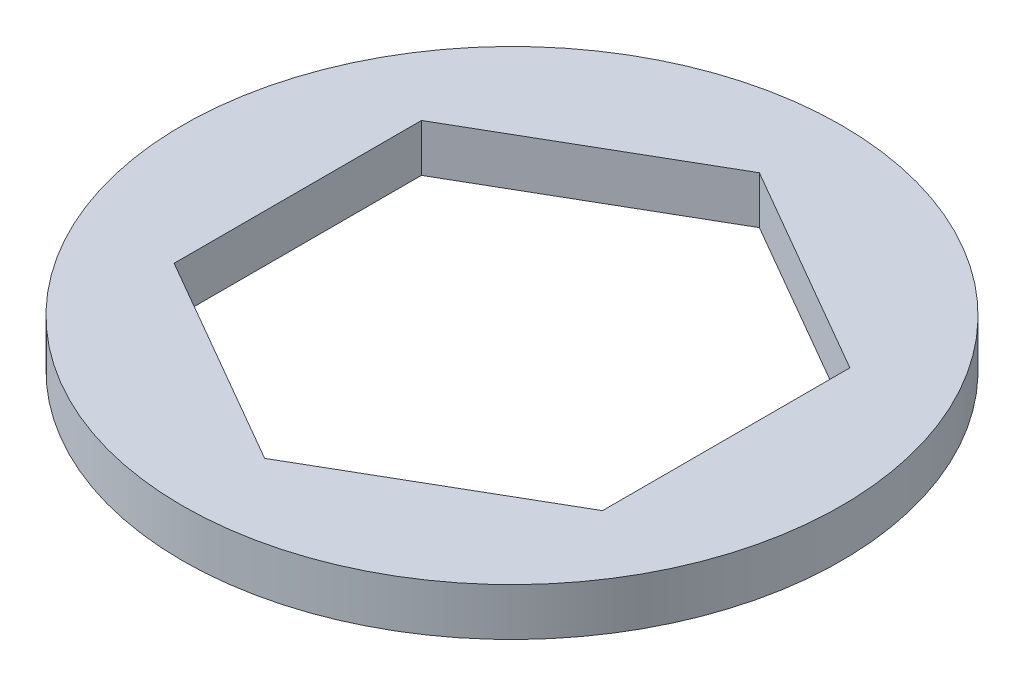
ISO-10303-21;
HEADER;
FILE_DESCRIPTION(('STEP AP214'),'2;1');
FILE_NAME('part.step','',(''),(''),'','','');
FILE_SCHEMA(('AUTOMOTIVE_DESIGN { 1 0 10303 214 1 1 1 1 }'));
ENDSEC;
DATA;
#1=APPLICATION_CONTEXT('core data for automotive mechanical design processes');
#2=APPLICATION_PROTOCOL_DEFINITION('international standard','automotive_design',2000,#1);
#3=PRODUCT_CONTEXT('',#1,'mechanical');
#4=PRODUCT('Part','Part','',(#3));
#5=PRODUCT_RELATED_PRODUCT_CATEGORY('part','',(#4));
#6=PRODUCT_DEFINITION_FORMATION('','',#4);
#7=PRODUCT_DEFINITION_CONTEXT('part definition',#1,'design');
#8=PRODUCT_DEFINITION('design','',#6,#7);
#9=PRODUCT_DEFINITION_SHAPE('','',#8);
#10=(LENGTH_UNIT() NAMED_UNIT(*) SI_UNIT(.MILLI.,.METRE.));
#11=(NAMED_UNIT(*) PLANE_ANGLE_UNIT() SI_UNIT($,.RADIAN.));
#12=(NAMED_UNIT(*) SI_UNIT($,.STERADIAN.) SOLID_ANGLE_UNIT());
#13=UNCERTAINTY_MEASURE_WITH_UNIT(LENGTH_MEASURE(1.E-05),#10,'distance_accuracy_value','');
#14=(GEOMETRIC_REPRESENTATION_CONTEXT(3) GLOBAL_UNCERTAINTY_ASSIGNED_CONTEXT((#13)) GLOBAL_UNIT_ASSIGNED_CONTEXT((#10,
#11,#12)) REPRESENTATION_CONTEXT('',''));
#15=CARTESIAN_POINT('',(0.,0.,0.));
#16=DIRECTION('',(0.,0.,1.));
#17=DIRECTION('',(1.,0.,0.));
#18=AXIS2_PLACEMENT_3D('',#15,#16,#17);
#19=CARTESIAN_POINT('',(0.,0.79375,0.));
#20=DIRECTION('',(0.,1.,0.));
#21=DIRECTION('',(0.,0.,1.));
#22=AXIS2_PLACEMENT_3D('',#19,#20,#21);
#23=PLANE('',#22);
#24=CARTESIAN_POINT('',(0.,0.79375,0.));
#25=DIRECTION('',(0.,1.,0.));
#26=DIRECTION('',(0.,0.,1.));
#27=AXIS2_PLACEMENT_3D('',#24,#25,#26);
#28=CIRCLE('',#27,5.5);
#29=CARTESIAN_POINT('',(0.,0.79375,5.5));
#30=VERTEX_POINT('',#29);
#31=EDGE_CURVE('E11',#30,#30,#28,.T.);
#32=ORIENTED_EDGE('',*,*,#31,.T.);
#33=EDGE_LOOP('',(#32));
#34=FACE_BOUND('',#33,.T.);
#35=DIRECTION('',(-0.866025403784438,0.,0.500000000000001));
#36=VECTOR('',#35,1.);
#37=CARTESIAN_POINT('',(0.,0.79375,-4.12805442470582));
#38=LINE('',#37,#36);
#39=CARTESIAN_POINT('',(0.,0.79375,-4.12805442470582));
#40=VERTEX_POINT('',#39);
#41=CARTESIAN_POINT('',(-3.575,0.79375,-2.0640272123529));
#42=VERTEX_POINT('',#41);
#43=EDGE_CURVE('E99',#40,#42,#38,.T.);
#44=ORIENTED_EDGE('',*,*,#43,.F.);
#45=DIRECTION('',(-0.866025403784441,0.,-0.499999999999995));
#46=VECTOR('',#45,1.);
#47=CARTESIAN_POINT('',(3.57499999999998,0.79375,-2.06402721235295));
#48=LINE('',#47,#46);
#49=CARTESIAN_POINT('',(3.57499999999998,0.79375,-2.06402721235295));
#50=VERTEX_POINT('',#49);
#51=EDGE_CURVE('E91',#50,#40,#48,.T.);
#52=ORIENTED_EDGE('',*,*,#51,.F.);
#53=DIRECTION('',(0.,0.,-1.));
#54=VECTOR('',#53,1.);
#55=CARTESIAN_POINT('',(3.57500000000002,0.79375,2.06402721235288));
#56=LINE('',#55,#54);
#57=CARTESIAN_POINT('',(3.57500000000002,0.79375,2.06402721235288));
#58=VERTEX_POINT('',#57);
#59=EDGE_CURVE('E119',#58,#50,#56,.T.);
#60=ORIENTED_EDGE('',*,*,#59,.F.);
#61=DIRECTION('',(0.866025403784434,0.,-0.500000000000007));
#62=VECTOR('',#61,1.);
#63=CARTESIAN_POINT('',(0.,0.79375,4.12805442470582));
#64=LINE('',#63,#62);
#65=CARTESIAN_POINT('',(0.,0.79375,4.12805442470582));
#66=VERTEX_POINT('',#65);
#67=EDGE_CURVE('E117',#66,#58,#64,.T.);
#68=ORIENTED_EDGE('',*,*,#67,.F.);
#69=DIRECTION('',(0.866025403784441,0.,0.499999999999995));
#70=VECTOR('',#69,1.);
#71=CARTESIAN_POINT('',(-3.57499999999999,0.79375,2.06402721235293));
#72=LINE('',#71,#70);
#73=CARTESIAN_POINT('',(-3.57499999999999,0.79375,2.06402721235293));
#74=VERTEX_POINT('',#73);
#75=EDGE_CURVE('E113',#74,#66,#72,.T.);
#76=ORIENTED_EDGE('',*,*,#75,.F.);
#77=DIRECTION('',(0.,0.,1.));
#78=VECTOR('',#77,1.);
#79=CARTESIAN_POINT('',(-3.575,0.79375,-2.0640272123529));
#80=LINE('',#79,#78);
#81=EDGE_CURVE('E111',#42,#74,#80,.T.);
#82=ORIENTED_EDGE('',*,*,#81,.F.);
#83=EDGE_LOOP('',(#44,#52,#60,#68,#76,#82));
#84=FACE_BOUND('',#83,.T.);
#85=ADVANCED_FACE('F38',(#34,#84),#23,.T.);
#86=CARTESIAN_POINT('',(0.,0.,0.));
#87=DIRECTION('',(0.,1.,0.));
#88=DIRECTION('',(0.,0.,1.));
#89=AXIS2_PLACEMENT_3D('',#86,#87,#88);
#90=PLANE('',#89);
#91=CARTESIAN_POINT('',(0.,0.,0.));
#92=DIRECTION('',(0.,1.,0.));
#93=DIRECTION('',(0.,0.,1.));
#94=AXIS2_PLACEMENT_3D('',#91,#92,#93);
#95=CIRCLE('',#94,5.5);
#96=CARTESIAN_POINT('',(0.,0.,5.5));
#97=VERTEX_POINT('',#96);
#98=EDGE_CURVE('E42',#97,#97,#95,.T.);
#99=ORIENTED_EDGE('',*,*,#98,.F.);
#100=EDGE_LOOP('',(#99));
#101=FACE_BOUND('',#100,.T.);
#102=DIRECTION('',(-0.866025403784441,0.,-0.499999999999995));
#103=VECTOR('',#102,1.);
#104=CARTESIAN_POINT('',(3.57499999999998,0.,-2.06402721235295));
#105=LINE('',#104,#103);
#106=CARTESIAN_POINT('',(3.57499999999998,0.,-2.06402721235295));
#107=VERTEX_POINT('',#106);
#108=CARTESIAN_POINT('',(0.,0.,-4.12805442470582));
#109=VERTEX_POINT('',#108);
#110=EDGE_CURVE('E61',#107,#109,#105,.T.);
#111=ORIENTED_EDGE('',*,*,#110,.T.);
#112=DIRECTION('',(-0.866025403784438,0.,0.500000000000001));
#113=VECTOR('',#112,1.);
#114=CARTESIAN_POINT('',(0.,0.,-4.12805442470582));
#115=LINE('',#114,#113);
#116=CARTESIAN_POINT('',(-3.575,0.,-2.0640272123529));
#117=VERTEX_POINT('',#116);
#118=EDGE_CURVE('E106',#109,#117,#115,.T.);
#119=ORIENTED_EDGE('',*,*,#118,.T.);
#120=DIRECTION('',(0.,0.,1.));
#121=VECTOR('',#120,1.);
#122=CARTESIAN_POINT('',(-3.575,0.,-2.0640272123529));
#123=LINE('',#122,#121);
#124=CARTESIAN_POINT('',(-3.57499999999999,0.,2.06402721235293));
#125=VERTEX_POINT('',#124);
#126=EDGE_CURVE('E123',#117,#125,#123,.T.);
#127=ORIENTED_EDGE('',*,*,#126,.T.);
#128=DIRECTION('',(0.866025403784441,0.,0.499999999999995));
#129=VECTOR('',#128,1.);
#130=CARTESIAN_POINT('',(-3.57499999999999,0.,2.06402721235293));
#131=LINE('',#130,#129);
#132=CARTESIAN_POINT('',(0.,0.,4.12805442470582));
#133=VERTEX_POINT('',#132);
#134=EDGE_CURVE('E126',#125,#133,#131,.T.);
#135=ORIENTED_EDGE('',*,*,#134,.T.);
#136=DIRECTION('',(0.866025403784434,0.,-0.500000000000007));
#137=VECTOR('',#136,1.);
#138=CARTESIAN_POINT('',(0.,0.,4.12805442470582));
#139=LINE('',#138,#137);
#140=CARTESIAN_POINT('',(3.57500000000002,0.,2.06402721235288));
#141=VERTEX_POINT('',#140);
#142=EDGE_CURVE('E129',#133,#141,#139,.T.);
#143=ORIENTED_EDGE('',*,*,#142,.T.);
#144=DIRECTION('',(0.,0.,-1.));
#145=VECTOR('',#144,1.);
#146=CARTESIAN_POINT('',(3.57500000000002,0.,2.06402721235288));
#147=LINE('',#146,#145);
#148=EDGE_CURVE('E100',#141,#107,#147,.T.);
#149=ORIENTED_EDGE('',*,*,#148,.T.);
#150=EDGE_LOOP('',(#111,#119,#127,#135,#143,#149));
#151=FACE_BOUND('',#150,.T.);
#152=ADVANCED_FACE('F146',(#101,#151),#90,.F.);
#153=CARTESIAN_POINT('',(0.,0.79375,0.));
#154=DIRECTION('',(0.,-1.,0.));
#155=DIRECTION('',(0.,0.,-1.));
#156=AXIS2_PLACEMENT_3D('',#153,#154,#155);
#157=CYLINDRICAL_SURFACE('',#156,5.5);
#158=ORIENTED_EDGE('',*,*,#31,.F.);
#159=EDGE_LOOP('',(#158));
#160=FACE_BOUND('',#159,.T.);
#161=ORIENTED_EDGE('',*,*,#98,.T.);
#162=EDGE_LOOP('',(#161));
#163=FACE_BOUND('',#162,.T.);
#164=ADVANCED_FACE('F40',(#160,#163),#157,.T.);
#165=CARTESIAN_POINT('',(3.57499999999998,0.79375,-2.06402721235295));
#166=DIRECTION('',(-0.499999999999995,0.,0.866025403784441));
#167=DIRECTION('',(0.866025403784441,0.,0.499999999999995));
#168=AXIS2_PLACEMENT_3D('',#165,#166,#167);
#169=PLANE('',#168);
#170=ORIENTED_EDGE('',*,*,#110,.F.);
#171=DIRECTION('',(0.,-1.,0.));
#172=VECTOR('',#171,1.);
#173=CARTESIAN_POINT('',(3.57499999999998,0.79375,-2.06402721235295));
#174=LINE('',#173,#172);
#175=EDGE_CURVE('E95',#50,#107,#174,.T.);
#176=ORIENTED_EDGE('',*,*,#175,.F.);
#177=ORIENTED_EDGE('',*,*,#51,.T.);
#178=DIRECTION('',(0.,-1.,0.));
#179=VECTOR('',#178,1.);
#180=CARTESIAN_POINT('',(0.,0.79375,-4.12805442470582));
#181=LINE('',#180,#179);
#182=EDGE_CURVE('E94',#40,#109,#181,.T.);
#183=ORIENTED_EDGE('',*,*,#182,.T.);
#184=EDGE_LOOP('',(#170,#176,#177,#183));
#185=FACE_BOUND('',#184,.T.);
#186=ADVANCED_FACE('F93',(#185),#169,.T.);
#187=CARTESIAN_POINT('',(0.,0.79375,-4.12805442470582));
#188=DIRECTION('',(0.500000000000001,0.,0.866025403784438));
#189=DIRECTION('',(0.866025403784438,0.,-0.500000000000001));
#190=AXIS2_PLACEMENT_3D('',#187,#188,#189);
#191=PLANE('',#190);
#192=ORIENTED_EDGE('',*,*,#118,.F.);
#193=ORIENTED_EDGE('',*,*,#182,.F.);
#194=ORIENTED_EDGE('',*,*,#43,.T.);
#195=DIRECTION('',(0.,-1.,0.));
#196=VECTOR('',#195,1.);
#197=CARTESIAN_POINT('',(-3.575,0.79375,-2.0640272123529));
#198=LINE('',#197,#196);
#199=EDGE_CURVE('E107',#42,#117,#198,.T.);
#200=ORIENTED_EDGE('',*,*,#199,.T.);
#201=EDGE_LOOP('',(#192,#193,#194,#200));
#202=FACE_BOUND('',#201,.T.);
#203=ADVANCED_FACE('F103',(#202),#191,.T.);
#204=CARTESIAN_POINT('',(-3.575,0.79375,-2.0640272123529));
#205=DIRECTION('',(1.,0.,0.));
#206=DIRECTION('',(0.,0.,-1.));
#207=AXIS2_PLACEMENT_3D('',#204,#205,#206);
#208=PLANE('',#207);
#209=ORIENTED_EDGE('',*,*,#126,.F.);
#210=ORIENTED_EDGE('',*,*,#199,.F.);
#211=ORIENTED_EDGE('',*,*,#81,.T.);
#212=DIRECTION('',(0.,-1.,0.));
#213=VECTOR('',#212,1.);
#214=CARTESIAN_POINT('',(-3.57499999999999,0.79375,2.06402721235293));
#215=LINE('',#214,#213);
#216=EDGE_CURVE('E138',#74,#125,#215,.T.);
#217=ORIENTED_EDGE('',*,*,#216,.T.);
#218=EDGE_LOOP('',(#209,#210,#211,#217));
#219=FACE_BOUND('',#218,.T.);
#220=ADVANCED_FACE('F142',(#219),#208,.T.);
#221=CARTESIAN_POINT('',(-3.57499999999999,0.79375,2.06402721235293));
#222=DIRECTION('',(0.499999999999995,0.,-0.866025403784442));
#223=DIRECTION('',(-0.866025403784442,0.,-0.499999999999995));
#224=AXIS2_PLACEMENT_3D('',#221,#222,#223);
#225=PLANE('',#224);
#226=ORIENTED_EDGE('',*,*,#134,.F.);
#227=ORIENTED_EDGE('',*,*,#216,.F.);
#228=ORIENTED_EDGE('',*,*,#75,.T.);
#229=DIRECTION('',(0.,-1.,0.));
#230=VECTOR('',#229,1.);
#231=CARTESIAN_POINT('',(0.,0.79375,4.12805442470582));
#232=LINE('',#231,#230);
#233=EDGE_CURVE('E136',#66,#133,#232,.T.);
#234=ORIENTED_EDGE('',*,*,#233,.T.);
#235=EDGE_LOOP('',(#226,#227,#228,#234));
#236=FACE_BOUND('',#235,.T.);
#237=ADVANCED_FACE('F154',(#236),#225,.T.);
#238=CARTESIAN_POINT('',(0.,0.79375,4.12805442470582));
#239=DIRECTION('',(-0.500000000000007,0.,-0.866025403784435));
#240=DIRECTION('',(-0.866025403784434,0.,0.500000000000007));
#241=AXIS2_PLACEMENT_3D('',#238,#239,#240);
#242=PLANE('',#241);
#243=ORIENTED_EDGE('',*,*,#142,.F.);
#244=ORIENTED_EDGE('',*,*,#233,.F.);
#245=ORIENTED_EDGE('',*,*,#67,.T.);
#246=DIRECTION('',(0.,-1.,0.));
#247=VECTOR('',#246,1.);
#248=CARTESIAN_POINT('',(3.57500000000002,0.79375,2.06402721235288));
#249=LINE('',#248,#247);
#250=EDGE_CURVE('E53',#58,#141,#249,.T.);
#251=ORIENTED_EDGE('',*,*,#250,.T.);
#252=EDGE_LOOP('',(#243,#244,#245,#251));
#253=FACE_BOUND('',#252,.T.);
#254=ADVANCED_FACE('F152',(#253),#242,.T.);
#255=CARTESIAN_POINT('',(3.57500000000002,0.79375,2.06402721235288));
#256=DIRECTION('',(-1.,0.,0.));
#257=DIRECTION('',(0.,0.,1.));
#258=AXIS2_PLACEMENT_3D('',#255,#256,#257);
#259=PLANE('',#258);
#260=ORIENTED_EDGE('',*,*,#148,.F.);
#261=ORIENTED_EDGE('',*,*,#250,.F.);
#262=ORIENTED_EDGE('',*,*,#59,.T.);
#263=ORIENTED_EDGE('',*,*,#175,.T.);
#264=EDGE_LOOP('',(#260,#261,#262,#263));
#265=FACE_BOUND('',#264,.T.);
#266=ADVANCED_FACE('F148',(#265),#259,.T.);
#267=CLOSED_SHELL('',(#85,#152,#164,#186,#203,#220,#237,#254,#266));
#268=MANIFOLD_SOLID_BREP('B2',#267);
#269=ADVANCED_BREP_SHAPE_REPRESENTATION('',(#18,#268),#14);
#270=SHAPE_DEFINITION_REPRESENTATION(#9,#269);
ENDSEC;
END-ISO-10303-21;
